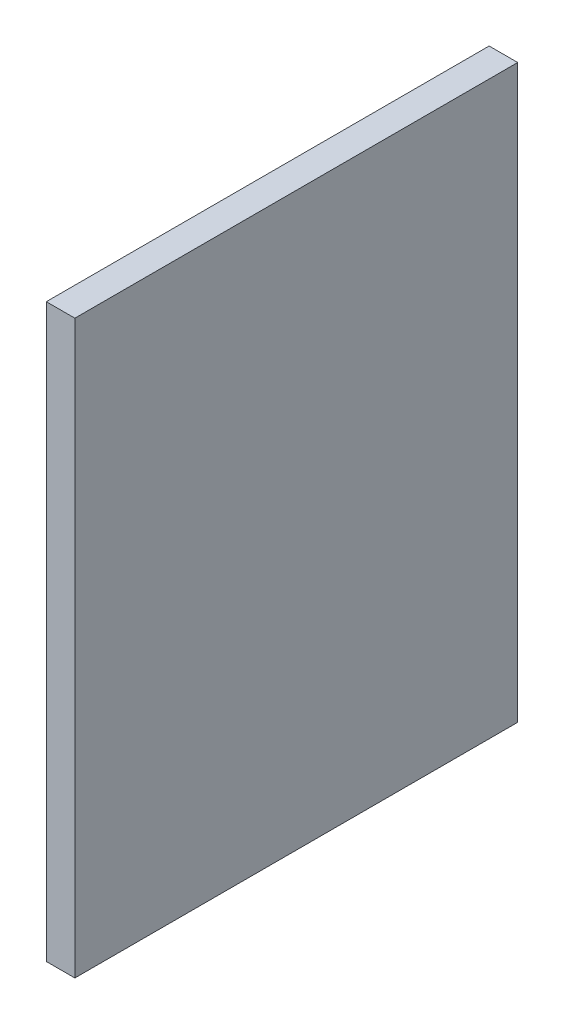
ISO-10303-21;
HEADER;
FILE_DESCRIPTION(('STEP AP214'),'2;1');
FILE_NAME('part.step','',(''),(''),'','','');
FILE_SCHEMA(('AUTOMOTIVE_DESIGN { 1 0 10303 214 1 1 1 1 }'));
ENDSEC;
DATA;
#1=APPLICATION_CONTEXT('core data for automotive mechanical design processes');
#2=APPLICATION_PROTOCOL_DEFINITION('international standard','automotive_design',2000,#1);
#3=PRODUCT_CONTEXT('',#1,'mechanical');
#4=PRODUCT('Part','Part','',(#3));
#5=PRODUCT_RELATED_PRODUCT_CATEGORY('part','',(#4));
#6=PRODUCT_DEFINITION_FORMATION('','',#4);
#7=PRODUCT_DEFINITION_CONTEXT('part definition',#1,'design');
#8=PRODUCT_DEFINITION('design','',#6,#7);
#9=PRODUCT_DEFINITION_SHAPE('','',#8);
#10=(LENGTH_UNIT() NAMED_UNIT(*) SI_UNIT(.MILLI.,.METRE.));
#11=(NAMED_UNIT(*) PLANE_ANGLE_UNIT() SI_UNIT($,.RADIAN.));
#12=(NAMED_UNIT(*) SI_UNIT($,.STERADIAN.) SOLID_ANGLE_UNIT());
#13=UNCERTAINTY_MEASURE_WITH_UNIT(LENGTH_MEASURE(1.E-05),#10,'distance_accuracy_value','');
#14=(GEOMETRIC_REPRESENTATION_CONTEXT(3) GLOBAL_UNCERTAINTY_ASSIGNED_CONTEXT((#13)) GLOBAL_UNIT_ASSIGNED_CONTEXT((#10,
#11,#12)) REPRESENTATION_CONTEXT('',''));
#15=CARTESIAN_POINT('',(0.,0.,0.));
#16=DIRECTION('',(0.,0.,1.));
#17=DIRECTION('',(1.,0.,0.));
#18=AXIS2_PLACEMENT_3D('',#15,#16,#17);
#19=CARTESIAN_POINT('',(-155.,1030.,155.));
#20=DIRECTION('',(1.,0.,0.));
#21=DIRECTION('',(0.,0.,-1.));
#22=AXIS2_PLACEMENT_3D('',#19,#20,#21);
#23=PLANE('',#22);
#24=DIRECTION('',(0.,0.,1.));
#25=VECTOR('',#24,1.);
#26=CARTESIAN_POINT('',(-155.,630.,155.));
#27=LINE('',#26,#25);
#28=CARTESIAN_POINT('',(-155.,630.,-155.));
#29=VERTEX_POINT('',#28);
#30=CARTESIAN_POINT('',(-155.,630.,155.));
#31=VERTEX_POINT('',#30);
#32=EDGE_CURVE('E107',#29,#31,#27,.T.);
#33=ORIENTED_EDGE('',*,*,#32,.T.);
#34=DIRECTION('',(0.,-1.,0.));
#35=VECTOR('',#34,1.);
#36=CARTESIAN_POINT('',(-155.,1030.,155.));
#37=LINE('',#36,#35);
#38=CARTESIAN_POINT('',(-155.,1030.,155.));
#39=VERTEX_POINT('',#38);
#40=EDGE_CURVE('E11',#39,#31,#37,.T.);
#41=ORIENTED_EDGE('',*,*,#40,.F.);
#42=DIRECTION('',(0.,0.,1.));
#43=VECTOR('',#42,1.);
#44=CARTESIAN_POINT('',(-155.,1030.,155.));
#45=LINE('',#44,#43);
#46=CARTESIAN_POINT('',(-155.,1030.,-155.));
#47=VERTEX_POINT('',#46);
#48=EDGE_CURVE('E91',#47,#39,#45,.T.);
#49=ORIENTED_EDGE('',*,*,#48,.F.);
#50=DIRECTION('',(0.,-1.,0.));
#51=VECTOR('',#50,1.);
#52=CARTESIAN_POINT('',(-155.,1030.,-155.));
#53=LINE('',#52,#51);
#54=EDGE_CURVE('E103',#47,#29,#53,.T.);
#55=ORIENTED_EDGE('',*,*,#54,.T.);
#56=EDGE_LOOP('',(#33,#41,#49,#55));
#57=FACE_BOUND('',#56,.T.);
#58=ADVANCED_FACE('F39',(#57),#23,.F.);
#59=CARTESIAN_POINT('',(-155.,1030.,155.));
#60=DIRECTION('',(0.,0.,-1.));
#61=DIRECTION('',(-1.,0.,0.));
#62=AXIS2_PLACEMENT_3D('',#59,#60,#61);
#63=PLANE('',#62);
#64=DIRECTION('',(1.,0.,0.));
#65=VECTOR('',#64,1.);
#66=CARTESIAN_POINT('',(-155.,630.,155.));
#67=LINE('',#66,#65);
#68=CARTESIAN_POINT('',(-135.,630.,155.));
#69=VERTEX_POINT('',#68);
#70=EDGE_CURVE('E96',#31,#69,#67,.T.);
#71=ORIENTED_EDGE('',*,*,#70,.T.);
#72=DIRECTION('',(0.,-1.,0.));
#73=VECTOR('',#72,1.);
#74=CARTESIAN_POINT('',(-135.,1030.,155.));
#75=LINE('',#74,#73);
#76=CARTESIAN_POINT('',(-135.,1030.,155.));
#77=VERTEX_POINT('',#76);
#78=EDGE_CURVE('E48',#77,#69,#75,.T.);
#79=ORIENTED_EDGE('',*,*,#78,.F.);
#80=DIRECTION('',(1.,0.,0.));
#81=VECTOR('',#80,1.);
#82=CARTESIAN_POINT('',(-155.,1030.,155.));
#83=LINE('',#82,#81);
#84=EDGE_CURVE('E86',#39,#77,#83,.T.);
#85=ORIENTED_EDGE('',*,*,#84,.F.);
#86=ORIENTED_EDGE('',*,*,#40,.T.);
#87=EDGE_LOOP('',(#71,#79,#85,#86));
#88=FACE_BOUND('',#87,.T.);
#89=ADVANCED_FACE('F95',(#88),#63,.F.);
#90=CARTESIAN_POINT('',(-135.,1030.,155.));
#91=DIRECTION('',(-1.,0.,0.));
#92=DIRECTION('',(0.,0.,1.));
#93=AXIS2_PLACEMENT_3D('',#90,#91,#92);
#94=PLANE('',#93);
#95=DIRECTION('',(0.,0.,-1.));
#96=VECTOR('',#95,1.);
#97=CARTESIAN_POINT('',(-135.,630.,155.));
#98=LINE('',#97,#96);
#99=CARTESIAN_POINT('',(-135.,630.,-155.));
#100=VERTEX_POINT('',#99);
#101=EDGE_CURVE('E73',#69,#100,#98,.T.);
#102=ORIENTED_EDGE('',*,*,#101,.T.);
#103=DIRECTION('',(0.,-1.,0.));
#104=VECTOR('',#103,1.);
#105=CARTESIAN_POINT('',(-135.,1030.,-155.));
#106=LINE('',#105,#104);
#107=CARTESIAN_POINT('',(-135.,1030.,-155.));
#108=VERTEX_POINT('',#107);
#109=EDGE_CURVE('E98',#108,#100,#106,.T.);
#110=ORIENTED_EDGE('',*,*,#109,.F.);
#111=DIRECTION('',(0.,0.,-1.));
#112=VECTOR('',#111,1.);
#113=CARTESIAN_POINT('',(-135.,1030.,155.));
#114=LINE('',#113,#112);
#115=EDGE_CURVE('E89',#77,#108,#114,.T.);
#116=ORIENTED_EDGE('',*,*,#115,.F.);
#117=ORIENTED_EDGE('',*,*,#78,.T.);
#118=EDGE_LOOP('',(#102,#110,#116,#117));
#119=FACE_BOUND('',#118,.T.);
#120=ADVANCED_FACE('F99',(#119),#94,.F.);
#121=CARTESIAN_POINT('',(-155.,1030.,-155.));
#122=DIRECTION('',(0.,0.,1.));
#123=DIRECTION('',(1.,0.,0.));
#124=AXIS2_PLACEMENT_3D('',#121,#122,#123);
#125=PLANE('',#124);
#126=DIRECTION('',(-1.,0.,0.));
#127=VECTOR('',#126,1.);
#128=CARTESIAN_POINT('',(-155.,630.,-155.));
#129=LINE('',#128,#127);
#130=EDGE_CURVE('E79',#100,#29,#129,.T.);
#131=ORIENTED_EDGE('',*,*,#130,.T.);
#132=ORIENTED_EDGE('',*,*,#54,.F.);
#133=DIRECTION('',(-1.,0.,0.));
#134=VECTOR('',#133,1.);
#135=CARTESIAN_POINT('',(-155.,1030.,-155.));
#136=LINE('',#135,#134);
#137=EDGE_CURVE('E56',#108,#47,#136,.T.);
#138=ORIENTED_EDGE('',*,*,#137,.F.);
#139=ORIENTED_EDGE('',*,*,#109,.T.);
#140=EDGE_LOOP('',(#131,#132,#138,#139));
#141=FACE_BOUND('',#140,.T.);
#142=ADVANCED_FACE('F120',(#141),#125,.F.);
#143=CARTESIAN_POINT('',(0.,1030.,0.));
#144=DIRECTION('',(0.,-1.,0.));
#145=DIRECTION('',(0.,0.,-1.));
#146=AXIS2_PLACEMENT_3D('',#143,#144,#145);
#147=PLANE('',#146);
#148=ORIENTED_EDGE('',*,*,#48,.T.);
#149=ORIENTED_EDGE('',*,*,#84,.T.);
#150=ORIENTED_EDGE('',*,*,#115,.T.);
#151=ORIENTED_EDGE('',*,*,#137,.T.);
#152=EDGE_LOOP('',(#148,#149,#150,#151));
#153=FACE_BOUND('',#152,.T.);
#154=ADVANCED_FACE('F87',(#153),#147,.F.);
#155=CARTESIAN_POINT('',(0.,630.,0.));
#156=DIRECTION('',(0.,-1.,0.));
#157=DIRECTION('',(0.,0.,-1.));
#158=AXIS2_PLACEMENT_3D('',#155,#156,#157);
#159=PLANE('',#158);
#160=ORIENTED_EDGE('',*,*,#32,.F.);
#161=ORIENTED_EDGE('',*,*,#130,.F.);
#162=ORIENTED_EDGE('',*,*,#101,.F.);
#163=ORIENTED_EDGE('',*,*,#70,.F.);
#164=EDGE_LOOP('',(#160,#161,#162,#163));
#165=FACE_BOUND('',#164,.T.);
#166=ADVANCED_FACE('F123',(#165),#159,.T.);
#167=CLOSED_SHELL('',(#58,#89,#120,#142,#154,#166));
#168=MANIFOLD_SOLID_BREP('B2',#167);
#169=ADVANCED_BREP_SHAPE_REPRESENTATION('',(#18,#168),#14);
#170=SHAPE_DEFINITION_REPRESENTATION(#9,#169);
ENDSEC;
END-ISO-10303-21;
